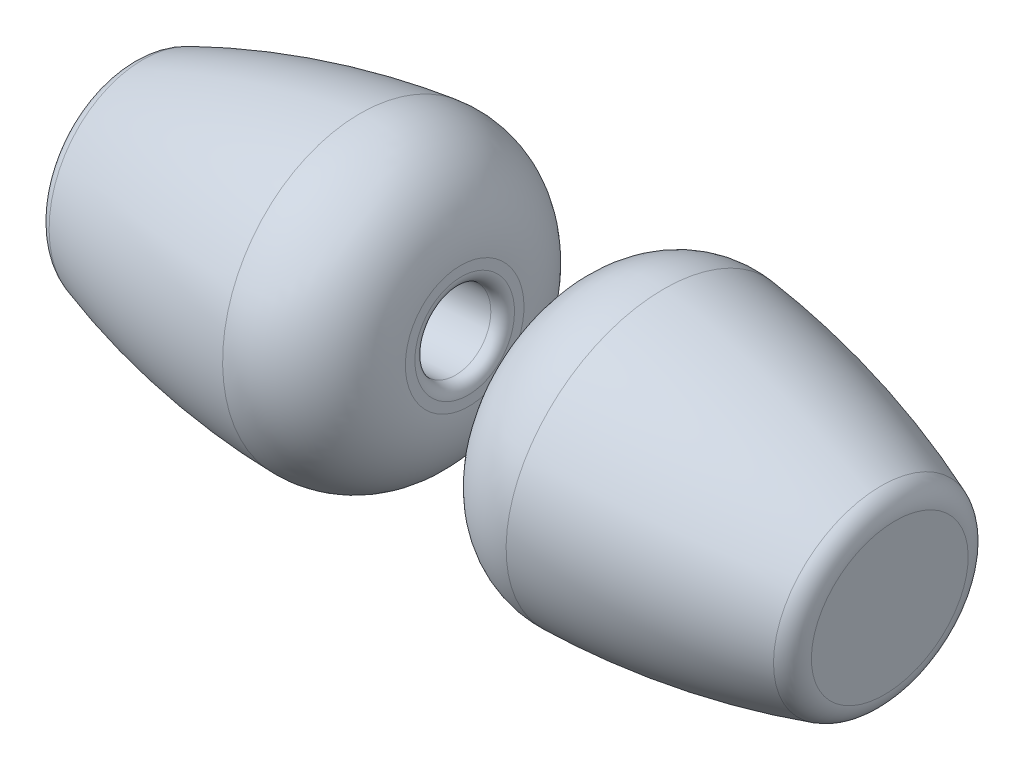
ISO-10303-21;
HEADER;
FILE_DESCRIPTION(('STEP AP214'),'2;1');
FILE_NAME('part.step','',(''),(''),'','','');
FILE_SCHEMA(('AUTOMOTIVE_DESIGN { 1 0 10303 214 1 1 1 1 }'));
ENDSEC;
DATA;
#1=APPLICATION_CONTEXT('core data for automotive mechanical design processes');
#2=APPLICATION_PROTOCOL_DEFINITION('international standard','automotive_design',2000,#1);
#3=PRODUCT_CONTEXT('',#1,'mechanical');
#4=PRODUCT('Part','Part','',(#3));
#5=PRODUCT_RELATED_PRODUCT_CATEGORY('part','',(#4));
#6=PRODUCT_DEFINITION_FORMATION('','',#4);
#7=PRODUCT_DEFINITION_CONTEXT('part definition',#1,'design');
#8=PRODUCT_DEFINITION('design','',#6,#7);
#9=PRODUCT_DEFINITION_SHAPE('','',#8);
#10=(LENGTH_UNIT() NAMED_UNIT(*) SI_UNIT(.MILLI.,.METRE.));
#11=(NAMED_UNIT(*) PLANE_ANGLE_UNIT() SI_UNIT($,.RADIAN.));
#12=(NAMED_UNIT(*) SI_UNIT($,.STERADIAN.) SOLID_ANGLE_UNIT());
#13=UNCERTAINTY_MEASURE_WITH_UNIT(LENGTH_MEASURE(1.E-05),#10,'distance_accuracy_value','');
#14=(GEOMETRIC_REPRESENTATION_CONTEXT(3) GLOBAL_UNCERTAINTY_ASSIGNED_CONTEXT((#13)) GLOBAL_UNIT_ASSIGNED_CONTEXT((#10,
#11,#12)) REPRESENTATION_CONTEXT('',''));
#15=CARTESIAN_POINT('',(0.,0.,0.));
#16=DIRECTION('',(0.,0.,1.));
#17=DIRECTION('',(1.,0.,0.));
#18=AXIS2_PLACEMENT_3D('',#15,#16,#17);
#19=CARTESIAN_POINT('',(-16.242863651309,160.834457444389,0.));
#20=DIRECTION('',(-0.997611399366225,-0.0690760150454681,0.));
#21=DIRECTION('',(-0.0690760150454681,0.997611399366225,0.));
#22=AXIS2_PLACEMENT_3D('',#19,#20,#21);
#23=PLANE('',#22);
#24=CARTESIAN_POINT('',(-15.9665595911271,156.844011846924,0.));
#25=DIRECTION('',(0.997611399366225,0.0690760150454681,0.));
#26=DIRECTION('',(-0.0690760150454681,0.997611399366225,0.));
#27=AXIS2_PLACEMENT_3D('',#24,#25,#26);
#28=CIRCLE('',#27,3.30542503677639);
#29=CARTESIAN_POINT('',(-16.1948851806992,160.141541543363,0.));
#30=VERTEX_POINT('',#29);
#31=EDGE_CURVE('E59',#30,#30,#28,.T.);
#32=ORIENTED_EDGE('',*,*,#31,.F.);
#33=EDGE_LOOP('',(#32));
#34=FACE_BOUND('',#33,.T.);
#35=ADVANCED_FACE('F44',(#34),#23,.T.);
#36=CARTESIAN_POINT('',(-3.52244998302165,157.705659481527,0.));
#37=DIRECTION('',(-0.997611399366225,-0.0690760150454681,0.));
#38=DIRECTION('',(-0.0690760150454681,0.997611399366225,0.));
#39=AXIS2_PLACEMENT_3D('',#36,#37,#38);
#40=DEGENERATE_TOROIDAL_SURFACE('',#39,28.4780833032829,34.7911511111625,.F.);
#41=CARTESIAN_POINT('',(-15.3076906681887,156.889632856932,0.));
#42=DIRECTION('',(-0.997611399366225,-0.0690760150454681,0.));
#43=DIRECTION('',(0.0690760150454681,-0.997611399366225,0.));
#44=AXIS2_PLACEMENT_3D('',#41,#42,#43);
#45=CIRCLE('',#44,4.24601176717516);
#46=CARTESIAN_POINT('',(-15.014393095476,152.653763116155,0.));
#47=VERTEX_POINT('',#46);
#48=EDGE_CURVE('E55',#47,#47,#45,.T.);
#49=ORIENTED_EDGE('',*,*,#48,.F.);
#50=EDGE_LOOP('',(#49));
#51=FACE_BOUND('',#50,.T.);
#52=CARTESIAN_POINT('',(-5.9904455974649,157.534771997379,0.));
#53=DIRECTION('',(0.997611399366225,0.0690760150454681,0.));
#54=DIRECTION('',(-0.0690760150454681,0.997611399366225,0.));
#55=AXIS2_PLACEMENT_3D('',#52,#53,#54);
#56=CIRCLE('',#55,6.225);
#57=CARTESIAN_POINT('',(-6.42044379112294,163.744902958434,0.));
#58=VERTEX_POINT('',#57);
#59=EDGE_CURVE('E64',#58,#58,#56,.T.);
#60=ORIENTED_EDGE('',*,*,#59,.F.);
#61=EDGE_LOOP('',(#60));
#62=FACE_BOUND('',#61,.T.);
#63=ADVANCED_FACE('F87',(#51,#62),#40,.F.);
#64=CARTESIAN_POINT('',(-5.7255330078988,157.553114917312,0.));
#65=DIRECTION('',(-0.997611399366225,-0.0690760150454681,0.));
#66=DIRECTION('',(-0.0690760150454681,0.997611399366225,0.));
#67=AXIS2_PLACEMENT_3D('',#64,#65,#66);
#68=DEGENERATE_TOROIDAL_SURFACE('',#67,2.50000000000004,3.73445312499997,.T.);
#69=CARTESIAN_POINT('',(-2.,157.811076057561,0.));
#70=DIRECTION('',(0.997611399366225,0.0690760150454681,0.));
#71=DIRECTION('',(-0.0690760150454681,0.997611399366225,0.));
#72=AXIS2_PLACEMENT_3D('',#69,#70,#71);
#73=CIRCLE('',#72,2.50000000000003);
#74=CARTESIAN_POINT('',(-2.17269003761367,160.305104555976,0.));
#75=VERTEX_POINT('',#74);
#76=EDGE_CURVE('E67',#75,#75,#73,.T.);
#77=ORIENTED_EDGE('',*,*,#76,.F.);
#78=EDGE_LOOP('',(#77));
#79=FACE_BOUND('',#78,.T.);
#80=ORIENTED_EDGE('',*,*,#59,.T.);
#81=EDGE_LOOP('',(#80));
#82=FACE_BOUND('',#81,.T.);
#83=ADVANCED_FACE('F93',(#79,#82),#68,.T.);
#84=CARTESIAN_POINT('',(-2.,157.811076057561,0.));
#85=DIRECTION('',(0.997611399366225,0.0690760150454681,0.));
#86=DIRECTION('',(0.0690760150454681,-0.997611399366225,0.));
#87=AXIS2_PLACEMENT_3D('',#84,#85,#86);
#88=PLANE('',#87);
#89=CARTESIAN_POINT('',(-2.,157.811076057561,0.));
#90=DIRECTION('',(-0.997611399366225,-0.0690760150454681,0.));
#91=DIRECTION('',(0.0690760150454681,-0.997611399366225,0.));
#92=AXIS2_PLACEMENT_3D('',#89,#90,#91);
#93=CIRCLE('',#92,2.09999999999999);
#94=CARTESIAN_POINT('',(-1.85494036840452,155.716092118892,0.));
#95=VERTEX_POINT('',#94);
#96=EDGE_CURVE('E11',#95,#95,#93,.F.);
#97=ORIENTED_EDGE('',*,*,#96,.F.);
#98=EDGE_LOOP('',(#97));
#99=FACE_BOUND('',#98,.T.);
#100=ORIENTED_EDGE('',*,*,#76,.T.);
#101=EDGE_LOOP('',(#100));
#102=FACE_BOUND('',#101,.T.);
#103=ADVANCED_FACE('F99',(#99,#102),#88,.T.);
#104=CARTESIAN_POINT('',(-14.9689481917609,156.91308786197,0.));
#105=DIRECTION('',(-0.997611399366225,-0.0690760150454681,0.));
#106=DIRECTION('',(-0.0690760150454681,0.997611399366225,0.));
#107=AXIS2_PLACEMENT_3D('',#104,#105,#106);
#108=TOROIDAL_SURFACE('',#107,3.30542503677639,1.);
#109=ORIENTED_EDGE('',*,*,#48,.T.);
#110=EDGE_LOOP('',(#109));
#111=FACE_BOUND('',#110,.T.);
#112=ORIENTED_EDGE('',*,*,#31,.T.);
#113=EDGE_LOOP('',(#112));
#114=FACE_BOUND('',#113,.T.);
#115=ADVANCED_FACE('F83',(#111,#114),#108,.T.);
#116=CARTESIAN_POINT('',(-11.9761139936623,157.120315907106,0.));
#117=DIRECTION('',(0.997611399366225,0.0690760150454681,0.));
#118=DIRECTION('',(0.0690760150454681,-0.997611399366225,0.));
#119=AXIS2_PLACEMENT_3D('',#116,#117,#118);
#120=CYLINDRICAL_SURFACE('',#119,1.59999999999999);
#121=CARTESIAN_POINT('',(-2.49880569968311,157.776538050038,0.));
#122=DIRECTION('',(-0.997611399366225,-0.0690760150454681,0.));
#123=DIRECTION('',(0.0690760150454681,-0.997611399366225,0.));
#124=AXIS2_PLACEMENT_3D('',#121,#122,#123);
#125=CIRCLE('',#124,1.59999999999999);
#126=CARTESIAN_POINT('',(-2.38828407561036,156.180359811052,0.));
#127=VERTEX_POINT('',#126);
#128=EDGE_CURVE('E51',#127,#127,#125,.T.);
#129=ORIENTED_EDGE('',*,*,#128,.F.);
#130=EDGE_LOOP('',(#129));
#131=FACE_BOUND('',#130,.T.);
#132=CARTESIAN_POINT('',(-11.9761139936623,157.120315907106,0.));
#133=DIRECTION('',(-0.997611399366225,-0.0690760150454681,0.));
#134=DIRECTION('',(0.0690760150454681,-0.997611399366225,0.));
#135=AXIS2_PLACEMENT_3D('',#132,#133,#134);
#136=CIRCLE('',#135,1.59999999999999);
#137=CARTESIAN_POINT('',(-11.8655923695895,155.52413766812,0.));
#138=VERTEX_POINT('',#137);
#139=EDGE_CURVE('E70',#138,#138,#136,.T.);
#140=ORIENTED_EDGE('',*,*,#139,.T.);
#141=EDGE_LOOP('',(#140));
#142=FACE_BOUND('',#141,.T.);
#143=ADVANCED_FACE('F74',(#131,#142),#120,.F.);
#144=CARTESIAN_POINT('',(-11.9761139936623,157.120315907106,0.));
#145=DIRECTION('',(0.997611399366225,0.0690760150454681,0.));
#146=DIRECTION('',(0.0690760150454681,-0.997611399366225,0.));
#147=AXIS2_PLACEMENT_3D('',#144,#145,#146);
#148=PLANE('',#147);
#149=ORIENTED_EDGE('',*,*,#139,.F.);
#150=EDGE_LOOP('',(#149));
#151=FACE_BOUND('',#150,.T.);
#152=ADVANCED_FACE('F76',(#151),#148,.T.);
#153=CARTESIAN_POINT('',(-2.49880569968311,157.776538050038,0.));
#154=DIRECTION('',(0.997611399366225,0.0690760150454681,0.));
#155=DIRECTION('',(0.0690760150454681,-0.997611399366225,0.));
#156=AXIS2_PLACEMENT_3D('',#153,#154,#155);
#157=TOROIDAL_SURFACE('',#156,2.09999999999999,0.5);
#158=ORIENTED_EDGE('',*,*,#96,.T.);
#159=EDGE_LOOP('',(#158));
#160=FACE_BOUND('',#159,.T.);
#161=ORIENTED_EDGE('',*,*,#128,.T.);
#162=EDGE_LOOP('',(#161));
#163=FACE_BOUND('',#162,.T.);
#164=ADVANCED_FACE('F46',(#160,#163),#157,.T.);
#165=CLOSED_SHELL('',(#35,#63,#83,#103,#115,#143,#152,#164));
#166=MANIFOLD_SOLID_BREP('B2',#165);
#167=CARTESIAN_POINT('',(16.242863651309,160.834457444389,0.));
#168=DIRECTION('',(0.997611399366225,-0.0690760150454681,0.));
#169=DIRECTION('',(0.0690760150454681,0.997611399366225,0.));
#170=AXIS2_PLACEMENT_3D('',#167,#168,#169);
#171=PLANE('',#170);
#172=CARTESIAN_POINT('',(15.9665595911271,156.844011846924,0.));
#173=DIRECTION('',(0.997611399366225,-0.0690760150454681,0.));
#174=DIRECTION('',(0.0690760150454681,0.997611399366225,0.));
#175=AXIS2_PLACEMENT_3D('',#172,#173,#174);
#176=CIRCLE('',#175,3.30542503677639);
#177=CARTESIAN_POINT('',(16.1948851806992,160.141541543363,0.));
#178=VERTEX_POINT('',#177);
#179=EDGE_CURVE('E204',#178,#178,#176,.T.);
#180=ORIENTED_EDGE('',*,*,#179,.T.);
#181=EDGE_LOOP('',(#180));
#182=FACE_BOUND('',#181,.T.);
#183=ADVANCED_FACE('F189',(#182),#171,.T.);
#184=CARTESIAN_POINT('',(3.52244998302165,157.705659481527,0.));
#185=DIRECTION('',(0.997611399366225,-0.0690760150454681,0.));
#186=DIRECTION('',(0.0690760150454681,0.997611399366225,0.));
#187=AXIS2_PLACEMENT_3D('',#184,#185,#186);
#188=DEGENERATE_TOROIDAL_SURFACE('',#187,28.4780833032829,34.7911511111625,.F.);
#189=CARTESIAN_POINT('',(15.3076906681887,156.889632856932,0.));
#190=DIRECTION('',(-0.997611399366225,0.0690760150454681,0.));
#191=DIRECTION('',(-0.0690760150454681,-0.997611399366225,0.));
#192=AXIS2_PLACEMENT_3D('',#189,#190,#191);
#193=CIRCLE('',#192,4.24601176717516);
#194=CARTESIAN_POINT('',(15.014393095476,152.653763116155,0.));
#195=VERTEX_POINT('',#194);
#196=EDGE_CURVE('E200',#195,#195,#193,.T.);
#197=ORIENTED_EDGE('',*,*,#196,.T.);
#198=EDGE_LOOP('',(#197));
#199=FACE_BOUND('',#198,.T.);
#200=CARTESIAN_POINT('',(5.9904455974649,157.534771997379,0.));
#201=DIRECTION('',(0.997611399366225,-0.0690760150454681,0.));
#202=DIRECTION('',(0.0690760150454681,0.997611399366225,0.));
#203=AXIS2_PLACEMENT_3D('',#200,#201,#202);
#204=CIRCLE('',#203,6.225);
#205=CARTESIAN_POINT('',(6.42044379112294,163.744902958434,0.));
#206=VERTEX_POINT('',#205);
#207=EDGE_CURVE('E209',#206,#206,#204,.T.);
#208=ORIENTED_EDGE('',*,*,#207,.T.);
#209=EDGE_LOOP('',(#208));
#210=FACE_BOUND('',#209,.T.);
#211=ADVANCED_FACE('F234',(#199,#210),#188,.F.);
#212=CARTESIAN_POINT('',(5.7255330078988,157.553114917312,0.));
#213=DIRECTION('',(0.997611399366225,-0.0690760150454681,0.));
#214=DIRECTION('',(0.0690760150454681,0.997611399366225,0.));
#215=AXIS2_PLACEMENT_3D('',#212,#213,#214);
#216=DEGENERATE_TOROIDAL_SURFACE('',#215,2.50000000000004,3.73445312499997,.T.);
#217=CARTESIAN_POINT('',(2.,157.811076057561,0.));
#218=DIRECTION('',(0.997611399366225,-0.0690760150454681,0.));
#219=DIRECTION('',(0.0690760150454681,0.997611399366225,0.));
#220=AXIS2_PLACEMENT_3D('',#217,#218,#219);
#221=CIRCLE('',#220,2.50000000000003);
#222=CARTESIAN_POINT('',(2.17269003761367,160.305104555976,0.));
#223=VERTEX_POINT('',#222);
#224=EDGE_CURVE('E212',#223,#223,#221,.T.);
#225=ORIENTED_EDGE('',*,*,#224,.T.);
#226=EDGE_LOOP('',(#225));
#227=FACE_BOUND('',#226,.T.);
#228=ORIENTED_EDGE('',*,*,#207,.F.);
#229=EDGE_LOOP('',(#228));
#230=FACE_BOUND('',#229,.T.);
#231=ADVANCED_FACE('F240',(#227,#230),#216,.T.);
#232=CARTESIAN_POINT('',(2.,157.811076057561,0.));
#233=DIRECTION('',(-0.997611399366225,0.0690760150454681,0.));
#234=DIRECTION('',(-0.0690760150454681,-0.997611399366225,0.));
#235=AXIS2_PLACEMENT_3D('',#232,#233,#234);
#236=PLANE('',#235);
#237=CARTESIAN_POINT('',(2.,157.811076057561,0.));
#238=DIRECTION('',(-0.997611399366225,0.0690760150454681,0.));
#239=DIRECTION('',(-0.0690760150454681,-0.997611399366225,0.));
#240=AXIS2_PLACEMENT_3D('',#237,#238,#239);
#241=CIRCLE('',#240,2.09999999999999);
#242=CARTESIAN_POINT('',(1.85494036840452,155.716092118892,0.));
#243=VERTEX_POINT('',#242);
#244=EDGE_CURVE('E43',#243,#243,#241,.F.);
#245=ORIENTED_EDGE('',*,*,#244,.T.);
#246=EDGE_LOOP('',(#245));
#247=FACE_BOUND('',#246,.T.);
#248=ORIENTED_EDGE('',*,*,#224,.F.);
#249=EDGE_LOOP('',(#248));
#250=FACE_BOUND('',#249,.T.);
#251=ADVANCED_FACE('F230',(#247,#250),#236,.T.);
#252=CARTESIAN_POINT('',(14.9689481917609,156.91308786197,0.));
#253=DIRECTION('',(0.997611399366225,-0.0690760150454681,0.));
#254=DIRECTION('',(0.0690760150454681,0.997611399366225,0.));
#255=AXIS2_PLACEMENT_3D('',#252,#253,#254);
#256=TOROIDAL_SURFACE('',#255,3.30542503677639,1.);
#257=ORIENTED_EDGE('',*,*,#196,.F.);
#258=EDGE_LOOP('',(#257));
#259=FACE_BOUND('',#258,.T.);
#260=ORIENTED_EDGE('',*,*,#179,.F.);
#261=EDGE_LOOP('',(#260));
#262=FACE_BOUND('',#261,.T.);
#263=ADVANCED_FACE('F223',(#259,#262),#256,.T.);
#264=CARTESIAN_POINT('',(11.9761139936623,157.120315907106,0.));
#265=DIRECTION('',(-0.997611399366225,0.0690760150454681,0.));
#266=DIRECTION('',(-0.0690760150454681,-0.997611399366225,0.));
#267=AXIS2_PLACEMENT_3D('',#264,#265,#266);
#268=CYLINDRICAL_SURFACE('',#267,1.59999999999999);
#269=CARTESIAN_POINT('',(2.49880569968311,157.776538050038,0.));
#270=DIRECTION('',(-0.997611399366225,0.0690760150454681,0.));
#271=DIRECTION('',(-0.0690760150454681,-0.997611399366225,0.));
#272=AXIS2_PLACEMENT_3D('',#269,#270,#271);
#273=CIRCLE('',#272,1.59999999999999);
#274=CARTESIAN_POINT('',(2.38828407561036,156.180359811052,0.));
#275=VERTEX_POINT('',#274);
#276=EDGE_CURVE('E196',#275,#275,#273,.T.);
#277=ORIENTED_EDGE('',*,*,#276,.T.);
#278=EDGE_LOOP('',(#277));
#279=FACE_BOUND('',#278,.T.);
#280=CARTESIAN_POINT('',(11.9761139936623,157.120315907106,0.));
#281=DIRECTION('',(-0.997611399366225,0.0690760150454681,0.));
#282=DIRECTION('',(-0.0690760150454681,-0.997611399366225,0.));
#283=AXIS2_PLACEMENT_3D('',#280,#281,#282);
#284=CIRCLE('',#283,1.59999999999999);
#285=CARTESIAN_POINT('',(11.8655923695895,155.52413766812,0.));
#286=VERTEX_POINT('',#285);
#287=EDGE_CURVE('E215',#286,#286,#284,.T.);
#288=ORIENTED_EDGE('',*,*,#287,.F.);
#289=EDGE_LOOP('',(#288));
#290=FACE_BOUND('',#289,.T.);
#291=ADVANCED_FACE('F221',(#279,#290),#268,.F.);
#292=CARTESIAN_POINT('',(11.9761139936623,157.120315907106,0.));
#293=DIRECTION('',(-0.997611399366225,0.0690760150454681,0.));
#294=DIRECTION('',(-0.0690760150454681,-0.997611399366225,0.));
#295=AXIS2_PLACEMENT_3D('',#292,#293,#294);
#296=PLANE('',#295);
#297=ORIENTED_EDGE('',*,*,#287,.T.);
#298=EDGE_LOOP('',(#297));
#299=FACE_BOUND('',#298,.T.);
#300=ADVANCED_FACE('F219',(#299),#296,.T.);
#301=CARTESIAN_POINT('',(2.49880569968311,157.776538050038,0.));
#302=DIRECTION('',(-0.997611399366225,0.0690760150454681,0.));
#303=DIRECTION('',(-0.0690760150454681,-0.997611399366225,0.));
#304=AXIS2_PLACEMENT_3D('',#301,#302,#303);
#305=TOROIDAL_SURFACE('',#304,2.09999999999999,0.5);
#306=ORIENTED_EDGE('',*,*,#244,.F.);
#307=EDGE_LOOP('',(#306));
#308=FACE_BOUND('',#307,.T.);
#309=ORIENTED_EDGE('',*,*,#276,.F.);
#310=EDGE_LOOP('',(#309));
#311=FACE_BOUND('',#310,.T.);
#312=ADVANCED_FACE('F191',(#308,#311),#305,.T.);
#313=CLOSED_SHELL('',(#183,#211,#231,#251,#263,#291,#300,#312));
#314=MANIFOLD_SOLID_BREP('B6',#313);
#315=ADVANCED_BREP_SHAPE_REPRESENTATION('',(#18,#166,#314),#14);
#316=SHAPE_DEFINITION_REPRESENTATION(#9,#315);
ENDSEC;
END-ISO-10303-21;
